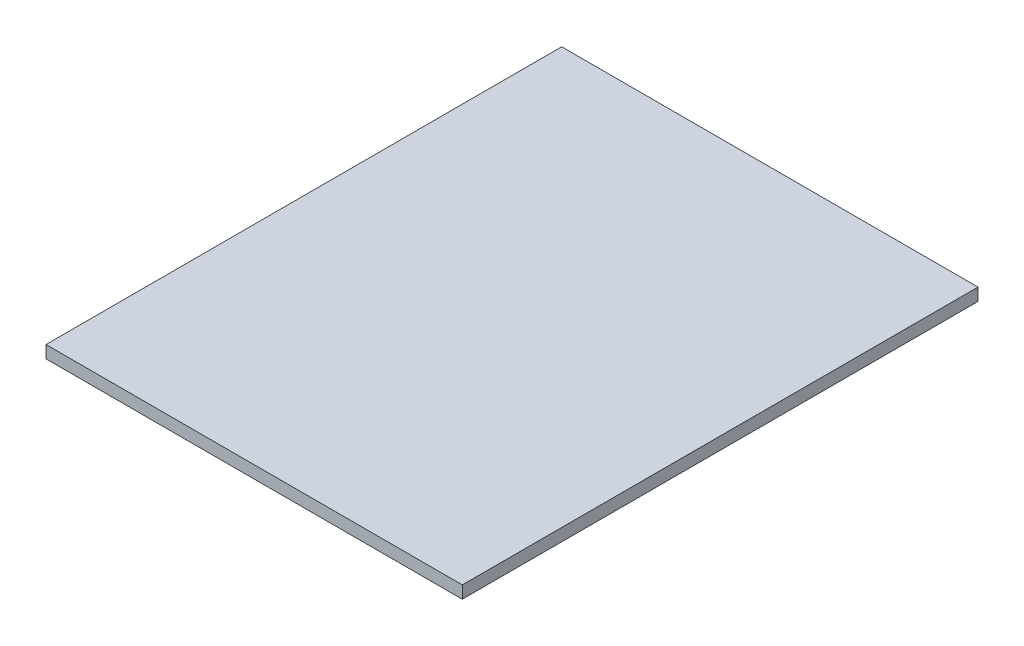
ISO-10303-21;
HEADER;
FILE_DESCRIPTION(('STEP AP214'),'2;1');
FILE_NAME('part.step','',(''),(''),'','','');
FILE_SCHEMA(('AUTOMOTIVE_DESIGN { 1 0 10303 214 1 1 1 1 }'));
ENDSEC;
DATA;
#1=APPLICATION_CONTEXT('core data for automotive mechanical design processes');
#2=APPLICATION_PROTOCOL_DEFINITION('international standard','automotive_design',2000,#1);
#3=PRODUCT_CONTEXT('',#1,'mechanical');
#4=PRODUCT('Part','Part','',(#3));
#5=PRODUCT_RELATED_PRODUCT_CATEGORY('part','',(#4));
#6=PRODUCT_DEFINITION_FORMATION('','',#4);
#7=PRODUCT_DEFINITION_CONTEXT('part definition',#1,'design');
#8=PRODUCT_DEFINITION('design','',#6,#7);
#9=PRODUCT_DEFINITION_SHAPE('','',#8);
#10=(LENGTH_UNIT() NAMED_UNIT(*) SI_UNIT(.MILLI.,.METRE.));
#11=(NAMED_UNIT(*) PLANE_ANGLE_UNIT() SI_UNIT($,.RADIAN.));
#12=(NAMED_UNIT(*) SI_UNIT($,.STERADIAN.) SOLID_ANGLE_UNIT());
#13=UNCERTAINTY_MEASURE_WITH_UNIT(LENGTH_MEASURE(1.E-05),#10,'distance_accuracy_value','');
#14=(GEOMETRIC_REPRESENTATION_CONTEXT(3) GLOBAL_UNCERTAINTY_ASSIGNED_CONTEXT((#13)) GLOBAL_UNIT_ASSIGNED_CONTEXT((#10,
#11,#12)) REPRESENTATION_CONTEXT('',''));
#15=CARTESIAN_POINT('',(0.,0.,0.));
#16=DIRECTION('',(0.,0.,1.));
#17=DIRECTION('',(1.,0.,0.));
#18=AXIS2_PLACEMENT_3D('',#15,#16,#17);
#19=CARTESIAN_POINT('',(-33.5,2.,41.5));
#20=DIRECTION('',(1.,0.,0.));
#21=DIRECTION('',(0.,0.,-1.));
#22=AXIS2_PLACEMENT_3D('',#19,#20,#21);
#23=PLANE('',#22);
#24=DIRECTION('',(0.,0.,1.));
#25=VECTOR('',#24,1.);
#26=CARTESIAN_POINT('',(-33.5,0.,41.5));
#27=LINE('',#26,#25);
#28=CARTESIAN_POINT('',(-33.5,0.,-41.5));
#29=VERTEX_POINT('',#28);
#30=CARTESIAN_POINT('',(-33.5,0.,41.5));
#31=VERTEX_POINT('',#30);
#32=EDGE_CURVE('E99',#29,#31,#27,.T.);
#33=ORIENTED_EDGE('',*,*,#32,.T.);
#34=DIRECTION('',(0.,-1.,0.));
#35=VECTOR('',#34,1.);
#36=CARTESIAN_POINT('',(-33.5,2.,41.5));
#37=LINE('',#36,#35);
#38=CARTESIAN_POINT('',(-33.5,2.,41.5));
#39=VERTEX_POINT('',#38);
#40=EDGE_CURVE('E11',#39,#31,#37,.T.);
#41=ORIENTED_EDGE('',*,*,#40,.F.);
#42=DIRECTION('',(0.,0.,1.));
#43=VECTOR('',#42,1.);
#44=CARTESIAN_POINT('',(-33.5,2.,41.5));
#45=LINE('',#44,#43);
#46=CARTESIAN_POINT('',(-33.5,2.,-41.5));
#47=VERTEX_POINT('',#46);
#48=EDGE_CURVE('E87',#47,#39,#45,.T.);
#49=ORIENTED_EDGE('',*,*,#48,.F.);
#50=DIRECTION('',(0.,-1.,0.));
#51=VECTOR('',#50,1.);
#52=CARTESIAN_POINT('',(-33.5,2.,-41.5));
#53=LINE('',#52,#51);
#54=EDGE_CURVE('E95',#47,#29,#53,.T.);
#55=ORIENTED_EDGE('',*,*,#54,.T.);
#56=EDGE_LOOP('',(#33,#41,#49,#55));
#57=FACE_BOUND('',#56,.T.);
#58=ADVANCED_FACE('F36',(#57),#23,.F.);
#59=CARTESIAN_POINT('',(33.5,2.,41.5));
#60=DIRECTION('',(0.,0.,-1.));
#61=DIRECTION('',(-1.,0.,0.));
#62=AXIS2_PLACEMENT_3D('',#59,#60,#61);
#63=PLANE('',#62);
#64=DIRECTION('',(1.,0.,0.));
#65=VECTOR('',#64,1.);
#66=CARTESIAN_POINT('',(33.5,0.,41.5));
#67=LINE('',#66,#65);
#68=CARTESIAN_POINT('',(33.5,0.,41.5));
#69=VERTEX_POINT('',#68);
#70=EDGE_CURVE('E91',#31,#69,#67,.T.);
#71=ORIENTED_EDGE('',*,*,#70,.T.);
#72=DIRECTION('',(0.,-1.,0.));
#73=VECTOR('',#72,1.);
#74=CARTESIAN_POINT('',(33.5,2.,41.5));
#75=LINE('',#74,#73);
#76=CARTESIAN_POINT('',(33.5,2.,41.5));
#77=VERTEX_POINT('',#76);
#78=EDGE_CURVE('E44',#77,#69,#75,.T.);
#79=ORIENTED_EDGE('',*,*,#78,.F.);
#80=DIRECTION('',(1.,0.,0.));
#81=VECTOR('',#80,1.);
#82=CARTESIAN_POINT('',(33.5,2.,41.5));
#83=LINE('',#82,#81);
#84=EDGE_CURVE('E82',#39,#77,#83,.T.);
#85=ORIENTED_EDGE('',*,*,#84,.F.);
#86=ORIENTED_EDGE('',*,*,#40,.T.);
#87=EDGE_LOOP('',(#71,#79,#85,#86));
#88=FACE_BOUND('',#87,.T.);
#89=ADVANCED_FACE('F90',(#88),#63,.F.);
#90=CARTESIAN_POINT('',(33.5,2.,41.5));
#91=DIRECTION('',(-1.,0.,0.));
#92=DIRECTION('',(0.,0.,1.));
#93=AXIS2_PLACEMENT_3D('',#90,#91,#92);
#94=PLANE('',#93);
#95=DIRECTION('',(0.,0.,-1.));
#96=VECTOR('',#95,1.);
#97=CARTESIAN_POINT('',(33.5,0.,41.5));
#98=LINE('',#97,#96);
#99=CARTESIAN_POINT('',(33.5,0.,-41.5));
#100=VERTEX_POINT('',#99);
#101=EDGE_CURVE('E69',#69,#100,#98,.T.);
#102=ORIENTED_EDGE('',*,*,#101,.T.);
#103=DIRECTION('',(0.,-1.,0.));
#104=VECTOR('',#103,1.);
#105=CARTESIAN_POINT('',(33.5,2.,-41.5));
#106=LINE('',#105,#104);
#107=CARTESIAN_POINT('',(33.5,2.,-41.5));
#108=VERTEX_POINT('',#107);
#109=EDGE_CURVE('E92',#108,#100,#106,.T.);
#110=ORIENTED_EDGE('',*,*,#109,.F.);
#111=DIRECTION('',(0.,0.,-1.));
#112=VECTOR('',#111,1.);
#113=CARTESIAN_POINT('',(33.5,2.,41.5));
#114=LINE('',#113,#112);
#115=EDGE_CURVE('E85',#77,#108,#114,.T.);
#116=ORIENTED_EDGE('',*,*,#115,.F.);
#117=ORIENTED_EDGE('',*,*,#78,.T.);
#118=EDGE_LOOP('',(#102,#110,#116,#117));
#119=FACE_BOUND('',#118,.T.);
#120=ADVANCED_FACE('F93',(#119),#94,.F.);
#121=CARTESIAN_POINT('',(33.5,2.,-41.5));
#122=DIRECTION('',(0.,0.,1.));
#123=DIRECTION('',(1.,0.,0.));
#124=AXIS2_PLACEMENT_3D('',#121,#122,#123);
#125=PLANE('',#124);
#126=DIRECTION('',(-1.,0.,0.));
#127=VECTOR('',#126,1.);
#128=CARTESIAN_POINT('',(33.5,0.,-41.5));
#129=LINE('',#128,#127);
#130=EDGE_CURVE('E75',#100,#29,#129,.T.);
#131=ORIENTED_EDGE('',*,*,#130,.T.);
#132=ORIENTED_EDGE('',*,*,#54,.F.);
#133=DIRECTION('',(-1.,0.,0.));
#134=VECTOR('',#133,1.);
#135=CARTESIAN_POINT('',(33.5,2.,-41.5));
#136=LINE('',#135,#134);
#137=EDGE_CURVE('E52',#108,#47,#136,.T.);
#138=ORIENTED_EDGE('',*,*,#137,.F.);
#139=ORIENTED_EDGE('',*,*,#109,.T.);
#140=EDGE_LOOP('',(#131,#132,#138,#139));
#141=FACE_BOUND('',#140,.T.);
#142=ADVANCED_FACE('F106',(#141),#125,.F.);
#143=CARTESIAN_POINT('',(0.,2.,0.));
#144=DIRECTION('',(0.,1.,0.));
#145=DIRECTION('',(0.,0.,1.));
#146=AXIS2_PLACEMENT_3D('',#143,#144,#145);
#147=PLANE('',#146);
#148=ORIENTED_EDGE('',*,*,#48,.T.);
#149=ORIENTED_EDGE('',*,*,#84,.T.);
#150=ORIENTED_EDGE('',*,*,#115,.T.);
#151=ORIENTED_EDGE('',*,*,#137,.T.);
#152=EDGE_LOOP('',(#148,#149,#150,#151));
#153=FACE_BOUND('',#152,.T.);
#154=ADVANCED_FACE('F83',(#153),#147,.T.);
#155=CARTESIAN_POINT('',(0.,0.,0.));
#156=DIRECTION('',(0.,1.,0.));
#157=DIRECTION('',(0.,0.,1.));
#158=AXIS2_PLACEMENT_3D('',#155,#156,#157);
#159=PLANE('',#158);
#160=ORIENTED_EDGE('',*,*,#32,.F.);
#161=ORIENTED_EDGE('',*,*,#130,.F.);
#162=ORIENTED_EDGE('',*,*,#101,.F.);
#163=ORIENTED_EDGE('',*,*,#70,.F.);
#164=EDGE_LOOP('',(#160,#161,#162,#163));
#165=FACE_BOUND('',#164,.T.);
#166=ADVANCED_FACE('F109',(#165),#159,.F.);
#167=CLOSED_SHELL('',(#58,#89,#120,#142,#154,#166));
#168=MANIFOLD_SOLID_BREP('B2',#167);
#169=ADVANCED_BREP_SHAPE_REPRESENTATION('',(#18,#168),#14);
#170=SHAPE_DEFINITION_REPRESENTATION(#9,#169);
ENDSEC;
END-ISO-10303-21;
